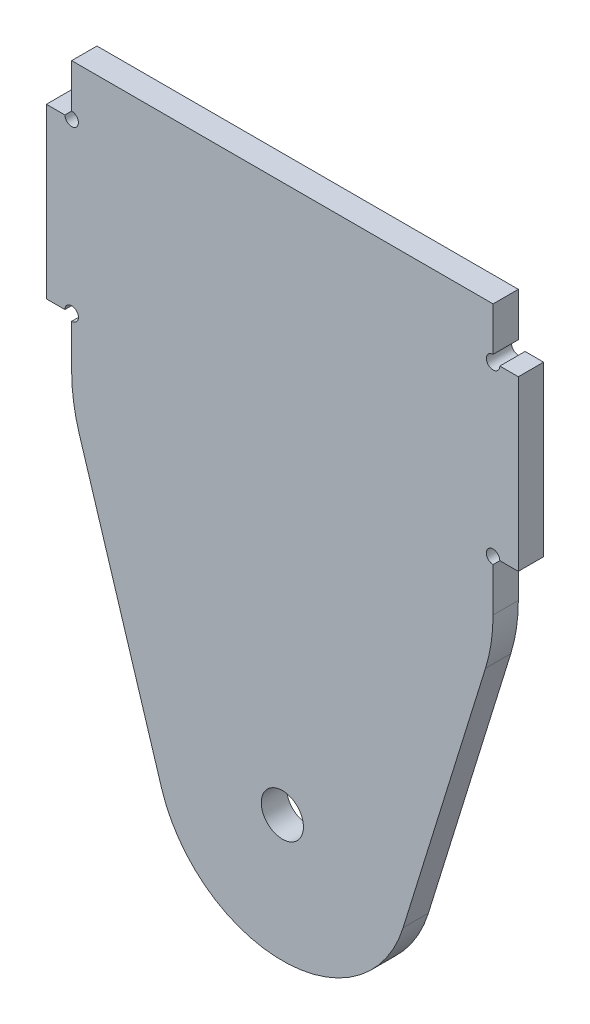
ISO-10303-21;
HEADER;
FILE_DESCRIPTION(('STEP AP214'),'2;1');
FILE_NAME('part.step','',(''),(''),'','','');
FILE_SCHEMA(('AUTOMOTIVE_DESIGN { 1 0 10303 214 1 1 1 1 }'));
ENDSEC;
DATA;
#1=APPLICATION_CONTEXT('core data for automotive mechanical design processes');
#2=APPLICATION_PROTOCOL_DEFINITION('international standard','automotive_design',2000,#1);
#3=PRODUCT_CONTEXT('',#1,'mechanical');
#4=PRODUCT('Part','Part','',(#3));
#5=PRODUCT_RELATED_PRODUCT_CATEGORY('part','',(#4));
#6=PRODUCT_DEFINITION_FORMATION('','',#4);
#7=PRODUCT_DEFINITION_CONTEXT('part definition',#1,'design');
#8=PRODUCT_DEFINITION('design','',#6,#7);
#9=PRODUCT_DEFINITION_SHAPE('','',#8);
#10=(LENGTH_UNIT() NAMED_UNIT(*) SI_UNIT(.MILLI.,.METRE.));
#11=(NAMED_UNIT(*) PLANE_ANGLE_UNIT() SI_UNIT($,.RADIAN.));
#12=(NAMED_UNIT(*) SI_UNIT($,.STERADIAN.) SOLID_ANGLE_UNIT());
#13=UNCERTAINTY_MEASURE_WITH_UNIT(LENGTH_MEASURE(1.E-05),#10,'distance_accuracy_value','');
#14=(GEOMETRIC_REPRESENTATION_CONTEXT(3) GLOBAL_UNCERTAINTY_ASSIGNED_CONTEXT((#13)) GLOBAL_UNIT_ASSIGNED_CONTEXT((#10,
#11,#12)) REPRESENTATION_CONTEXT('',''));
#15=CARTESIAN_POINT('',(0.,0.,0.));
#16=DIRECTION('',(0.,0.,1.));
#17=DIRECTION('',(1.,0.,0.));
#18=AXIS2_PLACEMENT_3D('',#15,#16,#17);
#19=CARTESIAN_POINT('',(25.,0.,3.));
#20=DIRECTION('',(-1.,0.,0.));
#21=DIRECTION('',(0.,-1.,0.));
#22=AXIS2_PLACEMENT_3D('',#19,#20,#21);
#23=PLANE('',#22);
#24=DIRECTION('',(0.,1.,0.));
#25=VECTOR('',#24,1.);
#26=CARTESIAN_POINT('',(25.,0.,0.));
#27=LINE('',#26,#25);
#28=CARTESIAN_POINT('',(25.,-14.4722436226801,0.));
#29=VERTEX_POINT('',#28);
#30=CARTESIAN_POINT('',(25.,-9.28612181134003,0.));
#31=VERTEX_POINT('',#30);
#32=EDGE_CURVE('E224',#29,#31,#27,.T.);
#33=ORIENTED_EDGE('',*,*,#32,.T.);
#34=DIRECTION('',(0.,0.,1.));
#35=VECTOR('',#34,1.);
#36=CARTESIAN_POINT('',(25.,-9.28612181134003,0.));
#37=LINE('',#36,#35);
#38=CARTESIAN_POINT('',(25.,-9.28612181134003,3.));
#39=VERTEX_POINT('',#38);
#40=EDGE_CURVE('E180',#31,#39,#37,.T.);
#41=ORIENTED_EDGE('',*,*,#40,.T.);
#42=DIRECTION('',(0.,1.,0.));
#43=VECTOR('',#42,1.);
#44=CARTESIAN_POINT('',(25.,0.,3.));
#45=LINE('',#44,#43);
#46=CARTESIAN_POINT('',(25.,-14.4722436226801,3.));
#47=VERTEX_POINT('',#46);
#48=EDGE_CURVE('E198',#47,#39,#45,.T.);
#49=ORIENTED_EDGE('',*,*,#48,.F.);
#50=DIRECTION('',(0.,0.,-1.));
#51=VECTOR('',#50,1.);
#52=CARTESIAN_POINT('',(25.,-14.4722436226801,0.));
#53=LINE('',#52,#51);
#54=EDGE_CURVE('E256',#47,#29,#53,.T.);
#55=ORIENTED_EDGE('',*,*,#54,.T.);
#56=EDGE_LOOP('',(#33,#41,#49,#55));
#57=FACE_BOUND('',#56,.T.);
#58=ADVANCED_FACE('F35',(#57),#23,.F.);
#59=CARTESIAN_POINT('',(-25.,0.,3.));
#60=DIRECTION('',(-1.,0.,0.));
#61=DIRECTION('',(0.,-1.,0.));
#62=AXIS2_PLACEMENT_3D('',#59,#60,#61);
#63=PLANE('',#62);
#64=DIRECTION('',(0.,0.,1.));
#65=VECTOR('',#64,1.);
#66=CARTESIAN_POINT('',(-25.,-9.28612181134003,0.));
#67=LINE('',#66,#65);
#68=CARTESIAN_POINT('',(-25.,-9.28612181134003,0.));
#69=VERTEX_POINT('',#68);
#70=CARTESIAN_POINT('',(-25.,-9.28612181134003,3.));
#71=VERTEX_POINT('',#70);
#72=EDGE_CURVE('E330',#69,#71,#67,.T.);
#73=ORIENTED_EDGE('',*,*,#72,.F.);
#74=DIRECTION('',(0.,1.,0.));
#75=VECTOR('',#74,1.);
#76=CARTESIAN_POINT('',(-25.,0.,0.));
#77=LINE('',#76,#75);
#78=CARTESIAN_POINT('',(-25.,-14.4722436226801,0.));
#79=VERTEX_POINT('',#78);
#80=EDGE_CURVE('E212',#79,#69,#77,.T.);
#81=ORIENTED_EDGE('',*,*,#80,.F.);
#82=DIRECTION('',(0.,0.,-1.));
#83=VECTOR('',#82,1.);
#84=CARTESIAN_POINT('',(-25.,-14.4722436226801,3.));
#85=LINE('',#84,#83);
#86=CARTESIAN_POINT('',(-25.,-14.4722436226801,3.));
#87=VERTEX_POINT('',#86);
#88=EDGE_CURVE('E250',#79,#87,#85,.F.);
#89=ORIENTED_EDGE('',*,*,#88,.T.);
#90=DIRECTION('',(0.,1.,0.));
#91=VECTOR('',#90,1.);
#92=CARTESIAN_POINT('',(-25.,0.,3.));
#93=LINE('',#92,#91);
#94=EDGE_CURVE('E301',#87,#71,#93,.T.);
#95=ORIENTED_EDGE('',*,*,#94,.T.);
#96=EDGE_LOOP('',(#73,#81,#89,#95));
#97=FACE_BOUND('',#96,.T.);
#98=ADVANCED_FACE('F364',(#97),#63,.T.);
#99=DIRECTION('',(0.,0.,1.));
#100=VECTOR('',#99,1.);
#101=CARTESIAN_POINT('',(-25.,12.31387818866,0.));
#102=LINE('',#101,#100);
#103=CARTESIAN_POINT('',(-25.,12.31387818866,3.));
#104=VERTEX_POINT('',#103);
#105=CARTESIAN_POINT('',(-25.,12.31387818866,0.));
#106=VERTEX_POINT('',#105);
#107=EDGE_CURVE('E328',#104,#106,#102,.F.);
#108=ORIENTED_EDGE('',*,*,#107,.F.);
#109=CARTESIAN_POINT('',(-25.,17.5,3.));
#110=VERTEX_POINT('',#109);
#111=EDGE_CURVE('E233',#104,#110,#93,.T.);
#112=ORIENTED_EDGE('',*,*,#111,.T.);
#113=DIRECTION('',(0.,0.,-1.));
#114=VECTOR('',#113,1.);
#115=CARTESIAN_POINT('',(-25.,17.5,3.));
#116=LINE('',#115,#114);
#117=CARTESIAN_POINT('',(-25.,17.5,0.));
#118=VERTEX_POINT('',#117);
#119=EDGE_CURVE('E211',#110,#118,#116,.T.);
#120=ORIENTED_EDGE('',*,*,#119,.T.);
#121=EDGE_CURVE('E216',#106,#118,#77,.T.);
#122=ORIENTED_EDGE('',*,*,#121,.F.);
#123=EDGE_LOOP('',(#108,#112,#120,#122));
#124=FACE_BOUND('',#123,.T.);
#125=ADVANCED_FACE('F383',(#124),#63,.T.);
#126=CARTESIAN_POINT('',(-27.757471044347,-8.60141557647442,3.));
#127=DIRECTION('',(0.955190414845375,0.295992012371146,0.));
#128=DIRECTION('',(-0.295992012371146,0.955190414845375,0.));
#129=AXIS2_PLACEMENT_3D('',#126,#127,#128);
#130=PLANE('',#129);
#131=DIRECTION('',(0.295992012371146,-0.955190414845375,0.));
#132=VECTOR('',#131,1.);
#133=CARTESIAN_POINT('',(-27.757471044347,-8.60141557647442,3.));
#134=LINE('',#133,#132);
#135=CARTESIAN_POINT('',(-24.1038082969075,-20.392083870103,3.));
#136=VERTEX_POINT('',#135);
#137=CARTESIAN_POINT('',(-14.3278562226806,-51.9398801855672,3.));
#138=VERTEX_POINT('',#137);
#139=EDGE_CURVE('E304',#136,#138,#134,.T.);
#140=ORIENTED_EDGE('',*,*,#139,.F.);
#141=DIRECTION('',(0.,0.,-1.));
#142=VECTOR('',#141,1.);
#143=CARTESIAN_POINT('',(-24.1038082969075,-20.392083870103,0.));
#144=LINE('',#143,#142);
#145=CARTESIAN_POINT('',(-24.1038082969075,-20.392083870103,0.));
#146=VERTEX_POINT('',#145);
#147=EDGE_CURVE('E243',#136,#146,#144,.T.);
#148=ORIENTED_EDGE('',*,*,#147,.T.);
#149=DIRECTION('',(0.295992012371146,-0.955190414845375,0.));
#150=VECTOR('',#149,1.);
#151=CARTESIAN_POINT('',(-27.757471044347,-8.60141557647442,0.));
#152=LINE('',#151,#150);
#153=CARTESIAN_POINT('',(-14.3278562226806,-51.9398801855672,0.));
#154=VERTEX_POINT('',#153);
#155=EDGE_CURVE('E215',#146,#154,#152,.T.);
#156=ORIENTED_EDGE('',*,*,#155,.T.);
#157=DIRECTION('',(0.,0.,-1.));
#158=VECTOR('',#157,1.);
#159=CARTESIAN_POINT('',(-14.3278562226806,-51.9398801855672,3.));
#160=LINE('',#159,#158);
#161=EDGE_CURVE('E240',#138,#154,#160,.T.);
#162=ORIENTED_EDGE('',*,*,#161,.F.);
#163=EDGE_LOOP('',(#140,#148,#156,#162));
#164=FACE_BOUND('',#163,.T.);
#165=ADVANCED_FACE('F371',(#164),#130,.F.);
#166=CARTESIAN_POINT('',(0.,-47.5,3.));
#167=DIRECTION('',(0.,0.,-1.));
#168=DIRECTION('',(-1.,0.,0.));
#169=AXIS2_PLACEMENT_3D('',#166,#167,#168);
#170=CYLINDRICAL_SURFACE('',#169,15.);
#171=CARTESIAN_POINT('',(0.,-47.5,0.));
#172=DIRECTION('',(0.,0.,1.));
#173=DIRECTION('',(1.,0.,0.));
#174=AXIS2_PLACEMENT_3D('',#171,#172,#173);
#175=CIRCLE('',#174,15.);
#176=CARTESIAN_POINT('',(14.3278562226806,-51.9398801855672,0.));
#177=VERTEX_POINT('',#176);
#178=EDGE_CURVE('E218',#154,#177,#175,.T.);
#179=ORIENTED_EDGE('',*,*,#178,.T.);
#180=DIRECTION('',(0.,0.,-1.));
#181=VECTOR('',#180,1.);
#182=CARTESIAN_POINT('',(14.3278562226806,-51.9398801855672,3.));
#183=LINE('',#182,#181);
#184=CARTESIAN_POINT('',(14.3278562226806,-51.9398801855672,3.));
#185=VERTEX_POINT('',#184);
#186=EDGE_CURVE('E237',#185,#177,#183,.T.);
#187=ORIENTED_EDGE('',*,*,#186,.F.);
#188=CARTESIAN_POINT('',(0.,-47.5,3.));
#189=DIRECTION('',(0.,0.,1.));
#190=DIRECTION('',(1.,0.,0.));
#191=AXIS2_PLACEMENT_3D('',#188,#189,#190);
#192=CIRCLE('',#191,15.);
#193=EDGE_CURVE('E203',#138,#185,#192,.T.);
#194=ORIENTED_EDGE('',*,*,#193,.F.);
#195=ORIENTED_EDGE('',*,*,#161,.T.);
#196=EDGE_LOOP('',(#179,#187,#194,#195));
#197=FACE_BOUND('',#196,.T.);
#198=ADVANCED_FACE('F313',(#197),#170,.T.);
#199=CARTESIAN_POINT('',(27.7574710443469,-8.60141557647441,3.));
#200=DIRECTION('',(0.955190414845375,-0.295992012371146,0.));
#201=DIRECTION('',(0.295992012371146,0.955190414845375,0.));
#202=AXIS2_PLACEMENT_3D('',#199,#200,#201);
#203=PLANE('',#202);
#204=DIRECTION('',(-0.295992012371146,-0.955190414845375,0.));
#205=VECTOR('',#204,1.);
#206=CARTESIAN_POINT('',(27.7574710443469,-8.60141557647441,0.));
#207=LINE('',#206,#205);
#208=CARTESIAN_POINT('',(24.1038082969075,-20.392083870103,0.));
#209=VERTEX_POINT('',#208);
#210=EDGE_CURVE('E221',#209,#177,#207,.T.);
#211=ORIENTED_EDGE('',*,*,#210,.F.);
#212=DIRECTION('',(0.,0.,-1.));
#213=VECTOR('',#212,1.);
#214=CARTESIAN_POINT('',(24.1038082969075,-20.392083870103,3.));
#215=LINE('',#214,#213);
#216=CARTESIAN_POINT('',(24.1038082969075,-20.392083870103,3.));
#217=VERTEX_POINT('',#216);
#218=EDGE_CURVE('E259',#209,#217,#215,.F.);
#219=ORIENTED_EDGE('',*,*,#218,.T.);
#220=DIRECTION('',(-0.295992012371146,-0.955190414845375,0.));
#221=VECTOR('',#220,1.);
#222=CARTESIAN_POINT('',(27.7574710443469,-8.60141557647441,3.));
#223=LINE('',#222,#221);
#224=EDGE_CURVE('E199',#217,#185,#223,.T.);
#225=ORIENTED_EDGE('',*,*,#224,.T.);
#226=ORIENTED_EDGE('',*,*,#186,.T.);
#227=EDGE_LOOP('',(#211,#219,#225,#226));
#228=FACE_BOUND('',#227,.T.);
#229=ADVANCED_FACE('F317',(#228),#203,.T.);
#230=CARTESIAN_POINT('',(25.,12.31387818866,3.));
#231=VERTEX_POINT('',#230);
#232=CARTESIAN_POINT('',(25.,17.5,3.));
#233=VERTEX_POINT('',#232);
#234=EDGE_CURVE('E187',#231,#233,#45,.T.);
#235=ORIENTED_EDGE('',*,*,#234,.F.);
#236=DIRECTION('',(0.,0.,1.));
#237=VECTOR('',#236,1.);
#238=CARTESIAN_POINT('',(25.,12.31387818866,0.));
#239=LINE('',#238,#237);
#240=CARTESIAN_POINT('',(25.,12.31387818866,0.));
#241=VERTEX_POINT('',#240);
#242=EDGE_CURVE('E170',#231,#241,#239,.F.);
#243=ORIENTED_EDGE('',*,*,#242,.T.);
#244=CARTESIAN_POINT('',(25.,17.5,0.));
#245=VERTEX_POINT('',#244);
#246=EDGE_CURVE('E223',#241,#245,#27,.T.);
#247=ORIENTED_EDGE('',*,*,#246,.T.);
#248=DIRECTION('',(0.,0.,-1.));
#249=VECTOR('',#248,1.);
#250=CARTESIAN_POINT('',(25.,17.5,3.));
#251=LINE('',#250,#249);
#252=EDGE_CURVE('E196',#233,#245,#251,.T.);
#253=ORIENTED_EDGE('',*,*,#252,.F.);
#254=EDGE_LOOP('',(#235,#243,#247,#253));
#255=FACE_BOUND('',#254,.T.);
#256=ADVANCED_FACE('F194',(#255),#23,.F.);
#257=CARTESIAN_POINT('',(0.,17.5,3.));
#258=DIRECTION('',(0.,1.,0.));
#259=DIRECTION('',(-1.,0.,0.));
#260=AXIS2_PLACEMENT_3D('',#257,#258,#259);
#261=PLANE('',#260);
#262=DIRECTION('',(1.,0.,0.));
#263=VECTOR('',#262,1.);
#264=CARTESIAN_POINT('',(0.,17.5,0.));
#265=LINE('',#264,#263);
#266=EDGE_CURVE('E227',#118,#245,#265,.T.);
#267=ORIENTED_EDGE('',*,*,#266,.F.);
#268=ORIENTED_EDGE('',*,*,#119,.F.);
#269=DIRECTION('',(1.,0.,0.));
#270=VECTOR('',#269,1.);
#271=CARTESIAN_POINT('',(0.,17.5,3.));
#272=LINE('',#271,#270);
#273=EDGE_CURVE('E202',#110,#233,#272,.T.);
#274=ORIENTED_EDGE('',*,*,#273,.T.);
#275=ORIENTED_EDGE('',*,*,#252,.T.);
#276=EDGE_LOOP('',(#267,#268,#274,#275));
#277=FACE_BOUND('',#276,.T.);
#278=ADVANCED_FACE('F387',(#277),#261,.T.);
#279=CARTESIAN_POINT('',(0.,-47.5,3.));
#280=DIRECTION('',(0.,0.,-1.));
#281=DIRECTION('',(-1.,0.,0.));
#282=AXIS2_PLACEMENT_3D('',#279,#280,#281);
#283=CYLINDRICAL_SURFACE('',#282,2.5);
#284=CARTESIAN_POINT('',(0.,-47.5,3.));
#285=DIRECTION('',(0.,0.,1.));
#286=DIRECTION('',(1.,0.,0.));
#287=AXIS2_PLACEMENT_3D('',#284,#285,#286);
#288=CIRCLE('',#287,2.5);
#289=CARTESIAN_POINT('',(2.50000000000001,-47.5,3.));
#290=VERTEX_POINT('',#289);
#291=EDGE_CURVE('E208',#290,#290,#288,.T.);
#292=ORIENTED_EDGE('',*,*,#291,.T.);
#293=EDGE_LOOP('',(#292));
#294=FACE_BOUND('',#293,.T.);
#295=CARTESIAN_POINT('',(0.,-47.5,0.));
#296=DIRECTION('',(0.,0.,1.));
#297=DIRECTION('',(1.,0.,0.));
#298=AXIS2_PLACEMENT_3D('',#295,#296,#297);
#299=CIRCLE('',#298,2.5);
#300=CARTESIAN_POINT('',(2.50000000000001,-47.5,0.));
#301=VERTEX_POINT('',#300);
#302=EDGE_CURVE('E230',#301,#301,#299,.T.);
#303=ORIENTED_EDGE('',*,*,#302,.F.);
#304=EDGE_LOOP('',(#303));
#305=FACE_BOUND('',#304,.T.);
#306=ADVANCED_FACE('F424',(#294,#305),#283,.F.);
#307=CARTESIAN_POINT('',(0.,0.,3.));
#308=DIRECTION('',(0.,0.,1.));
#309=DIRECTION('',(1.,0.,0.));
#310=AXIS2_PLACEMENT_3D('',#307,#308,#309);
#311=PLANE('',#310);
#312=CARTESIAN_POINT('',(-25.,-8.48612181134004,3.));
#313=DIRECTION('',(0.,0.,1.));
#314=DIRECTION('',(1.,0.,0.));
#315=AXIS2_PLACEMENT_3D('',#312,#313,#314);
#316=CIRCLE('',#315,0.799999999999999);
#317=CARTESIAN_POINT('',(-25.8,-8.48612181134004,3.));
#318=VERTEX_POINT('',#317);
#319=EDGE_CURVE('E49',#71,#318,#316,.T.);
#320=ORIENTED_EDGE('',*,*,#319,.F.);
#321=ORIENTED_EDGE('',*,*,#94,.F.);
#322=CARTESIAN_POINT('',(-5.,-14.4722436226801,3.));
#323=DIRECTION('',(0.,0.,1.));
#324=DIRECTION('',(1.,0.,0.));
#325=AXIS2_PLACEMENT_3D('',#322,#323,#324);
#326=CIRCLE('',#325,20.);
#327=EDGE_CURVE('E254',#87,#136,#326,.T.);
#328=ORIENTED_EDGE('',*,*,#327,.T.);
#329=ORIENTED_EDGE('',*,*,#139,.T.);
#330=ORIENTED_EDGE('',*,*,#193,.T.);
#331=ORIENTED_EDGE('',*,*,#224,.F.);
#332=CARTESIAN_POINT('',(5.,-14.4722436226801,3.));
#333=DIRECTION('',(0.,0.,1.));
#334=DIRECTION('',(1.,0.,0.));
#335=AXIS2_PLACEMENT_3D('',#332,#333,#334);
#336=CIRCLE('',#335,20.);
#337=EDGE_CURVE('E252',#217,#47,#336,.T.);
#338=ORIENTED_EDGE('',*,*,#337,.T.);
#339=ORIENTED_EDGE('',*,*,#48,.T.);
#340=CARTESIAN_POINT('',(25.,-8.48612181134004,3.));
#341=DIRECTION('',(0.,0.,1.));
#342=DIRECTION('',(1.,0.,0.));
#343=AXIS2_PLACEMENT_3D('',#340,#341,#342);
#344=CIRCLE('',#343,0.799999999999999);
#345=CARTESIAN_POINT('',(25.8,-8.48612181134004,3.));
#346=VERTEX_POINT('',#345);
#347=EDGE_CURVE('E375',#346,#39,#344,.T.);
#348=ORIENTED_EDGE('',*,*,#347,.F.);
#349=DIRECTION('',(1.,0.,0.));
#350=VECTOR('',#349,1.);
#351=CARTESIAN_POINT('',(28.,-8.48612181134004,3.));
#352=LINE('',#351,#350);
#353=CARTESIAN_POINT('',(28.,-8.48612181134004,3.));
#354=VERTEX_POINT('',#353);
#355=EDGE_CURVE('E342',#346,#354,#352,.T.);
#356=ORIENTED_EDGE('',*,*,#355,.T.);
#357=DIRECTION('',(0.,1.,0.));
#358=VECTOR('',#357,1.);
#359=CARTESIAN_POINT('',(28.,-8.48612181134004,3.));
#360=LINE('',#359,#358);
#361=CARTESIAN_POINT('',(28.,11.51387818866,3.));
#362=VERTEX_POINT('',#361);
#363=EDGE_CURVE('E334',#354,#362,#360,.T.);
#364=ORIENTED_EDGE('',*,*,#363,.T.);
#365=DIRECTION('',(-1.,0.,0.));
#366=VECTOR('',#365,1.);
#367=CARTESIAN_POINT('',(28.,11.51387818866,3.));
#368=LINE('',#367,#366);
#369=CARTESIAN_POINT('',(25.8,11.51387818866,3.));
#370=VERTEX_POINT('',#369);
#371=EDGE_CURVE('E191',#362,#370,#368,.T.);
#372=ORIENTED_EDGE('',*,*,#371,.T.);
#373=CARTESIAN_POINT('',(25.,11.51387818866,3.));
#374=DIRECTION('',(0.,0.,1.));
#375=DIRECTION('',(1.,0.,0.));
#376=AXIS2_PLACEMENT_3D('',#373,#374,#375);
#377=CIRCLE('',#376,0.799999999999999);
#378=EDGE_CURVE('E173',#231,#370,#377,.T.);
#379=ORIENTED_EDGE('',*,*,#378,.F.);
#380=ORIENTED_EDGE('',*,*,#234,.T.);
#381=ORIENTED_EDGE('',*,*,#273,.F.);
#382=ORIENTED_EDGE('',*,*,#111,.F.);
#383=CARTESIAN_POINT('',(-25.,11.51387818866,3.));
#384=DIRECTION('',(0.,0.,1.));
#385=DIRECTION('',(1.,0.,0.));
#386=AXIS2_PLACEMENT_3D('',#383,#384,#385);
#387=CIRCLE('',#386,0.799999999999999);
#388=CARTESIAN_POINT('',(-25.8,11.51387818866,3.));
#389=VERTEX_POINT('',#388);
#390=EDGE_CURVE('E266',#389,#104,#387,.T.);
#391=ORIENTED_EDGE('',*,*,#390,.F.);
#392=DIRECTION('',(-1.,0.,0.));
#393=VECTOR('',#392,1.);
#394=CARTESIAN_POINT('',(-28.,11.51387818866,3.));
#395=LINE('',#394,#393);
#396=CARTESIAN_POINT('',(-28.,11.51387818866,3.));
#397=VERTEX_POINT('',#396);
#398=EDGE_CURVE('E274',#389,#397,#395,.T.);
#399=ORIENTED_EDGE('',*,*,#398,.T.);
#400=DIRECTION('',(0.,-1.,0.));
#401=VECTOR('',#400,1.);
#402=CARTESIAN_POINT('',(-28.,-8.48612181134004,3.));
#403=LINE('',#402,#401);
#404=CARTESIAN_POINT('',(-28.,-8.48612181134004,3.));
#405=VERTEX_POINT('',#404);
#406=EDGE_CURVE('E282',#397,#405,#403,.T.);
#407=ORIENTED_EDGE('',*,*,#406,.T.);
#408=DIRECTION('',(1.,0.,0.));
#409=VECTOR('',#408,1.);
#410=CARTESIAN_POINT('',(-28.,-8.48612181134004,3.));
#411=LINE('',#410,#409);
#412=EDGE_CURVE('E285',#405,#318,#411,.T.);
#413=ORIENTED_EDGE('',*,*,#412,.T.);
#414=EDGE_LOOP('',(#320,#321,#328,#329,#330,#331,#338,#339,#348,#356,#364,#372,#379,#380,#381,
#382,#391,#399,#407,#413));
#415=FACE_BOUND('',#414,.T.);
#416=ORIENTED_EDGE('',*,*,#291,.F.);
#417=EDGE_LOOP('',(#416));
#418=FACE_BOUND('',#417,.T.);
#419=ADVANCED_FACE('F184',(#415,#418),#311,.T.);
#420=CARTESIAN_POINT('',(0.,0.,0.));
#421=DIRECTION('',(0.,0.,1.));
#422=DIRECTION('',(1.,0.,0.));
#423=AXIS2_PLACEMENT_3D('',#420,#421,#422);
#424=PLANE('',#423);
#425=ORIENTED_EDGE('',*,*,#80,.T.);
#426=CARTESIAN_POINT('',(-25.,-8.48612181134004,0.));
#427=DIRECTION('',(0.,0.,1.));
#428=DIRECTION('',(1.,0.,0.));
#429=AXIS2_PLACEMENT_3D('',#426,#427,#428);
#430=CIRCLE('',#429,0.799999999999999);
#431=CARTESIAN_POINT('',(-25.8,-8.48612181134004,0.));
#432=VERTEX_POINT('',#431);
#433=EDGE_CURVE('E276',#69,#432,#430,.T.);
#434=ORIENTED_EDGE('',*,*,#433,.T.);
#435=DIRECTION('',(-1.,0.,0.));
#436=VECTOR('',#435,1.);
#437=CARTESIAN_POINT('',(-28.,-8.48612181134004,0.));
#438=LINE('',#437,#436);
#439=CARTESIAN_POINT('',(-28.,-8.48612181134004,0.));
#440=VERTEX_POINT('',#439);
#441=EDGE_CURVE('E290',#432,#440,#438,.T.);
#442=ORIENTED_EDGE('',*,*,#441,.T.);
#443=DIRECTION('',(0.,1.,0.));
#444=VECTOR('',#443,1.);
#445=CARTESIAN_POINT('',(-28.,-8.48612181134004,0.));
#446=LINE('',#445,#444);
#447=CARTESIAN_POINT('',(-28.,11.51387818866,0.));
#448=VERTEX_POINT('',#447);
#449=EDGE_CURVE('E297',#440,#448,#446,.T.);
#450=ORIENTED_EDGE('',*,*,#449,.T.);
#451=DIRECTION('',(1.,0.,0.));
#452=VECTOR('',#451,1.);
#453=CARTESIAN_POINT('',(-28.,11.51387818866,0.));
#454=LINE('',#453,#452);
#455=CARTESIAN_POINT('',(-25.8,11.51387818866,0.));
#456=VERTEX_POINT('',#455);
#457=EDGE_CURVE('E299',#448,#456,#454,.T.);
#458=ORIENTED_EDGE('',*,*,#457,.T.);
#459=CARTESIAN_POINT('',(-25.,11.51387818866,0.));
#460=DIRECTION('',(0.,0.,1.));
#461=DIRECTION('',(1.,0.,0.));
#462=AXIS2_PLACEMENT_3D('',#459,#460,#461);
#463=CIRCLE('',#462,0.799999999999999);
#464=EDGE_CURVE('E57',#456,#106,#463,.T.);
#465=ORIENTED_EDGE('',*,*,#464,.T.);
#466=ORIENTED_EDGE('',*,*,#121,.T.);
#467=ORIENTED_EDGE('',*,*,#266,.T.);
#468=ORIENTED_EDGE('',*,*,#246,.F.);
#469=CARTESIAN_POINT('',(25.,11.51387818866,0.));
#470=DIRECTION('',(0.,0.,1.));
#471=DIRECTION('',(1.,0.,0.));
#472=AXIS2_PLACEMENT_3D('',#469,#470,#471);
#473=CIRCLE('',#472,0.799999999999999);
#474=CARTESIAN_POINT('',(25.8,11.51387818866,0.));
#475=VERTEX_POINT('',#474);
#476=EDGE_CURVE('E176',#241,#475,#473,.T.);
#477=ORIENTED_EDGE('',*,*,#476,.T.);
#478=DIRECTION('',(1.,0.,0.));
#479=VECTOR('',#478,1.);
#480=CARTESIAN_POINT('',(28.,11.51387818866,0.));
#481=LINE('',#480,#479);
#482=CARTESIAN_POINT('',(28.,11.51387818866,0.));
#483=VERTEX_POINT('',#482);
#484=EDGE_CURVE('E283',#475,#483,#481,.T.);
#485=ORIENTED_EDGE('',*,*,#484,.T.);
#486=DIRECTION('',(0.,-1.,0.));
#487=VECTOR('',#486,1.);
#488=CARTESIAN_POINT('',(28.,-8.48612181134004,0.));
#489=LINE('',#488,#487);
#490=CARTESIAN_POINT('',(28.,-8.48612181134004,0.));
#491=VERTEX_POINT('',#490);
#492=EDGE_CURVE('E287',#483,#491,#489,.T.);
#493=ORIENTED_EDGE('',*,*,#492,.T.);
#494=DIRECTION('',(-1.,0.,0.));
#495=VECTOR('',#494,1.);
#496=CARTESIAN_POINT('',(28.,-8.48612181134004,0.));
#497=LINE('',#496,#495);
#498=CARTESIAN_POINT('',(25.8,-8.48612181134004,0.));
#499=VERTEX_POINT('',#498);
#500=EDGE_CURVE('E335',#491,#499,#497,.T.);
#501=ORIENTED_EDGE('',*,*,#500,.T.);
#502=CARTESIAN_POINT('',(25.,-8.48612181134004,0.));
#503=DIRECTION('',(0.,0.,1.));
#504=DIRECTION('',(1.,0.,0.));
#505=AXIS2_PLACEMENT_3D('',#502,#503,#504);
#506=CIRCLE('',#505,0.799999999999999);
#507=EDGE_CURVE('E192',#499,#31,#506,.T.);
#508=ORIENTED_EDGE('',*,*,#507,.T.);
#509=ORIENTED_EDGE('',*,*,#32,.F.);
#510=CARTESIAN_POINT('',(5.,-14.4722436226801,0.));
#511=DIRECTION('',(0.,0.,1.));
#512=DIRECTION('',(1.,0.,0.));
#513=AXIS2_PLACEMENT_3D('',#510,#511,#512);
#514=CIRCLE('',#513,20.);
#515=EDGE_CURVE('E246',#29,#209,#514,.F.);
#516=ORIENTED_EDGE('',*,*,#515,.T.);
#517=ORIENTED_EDGE('',*,*,#210,.T.);
#518=ORIENTED_EDGE('',*,*,#178,.F.);
#519=ORIENTED_EDGE('',*,*,#155,.F.);
#520=CARTESIAN_POINT('',(-5.,-14.4722436226801,0.));
#521=DIRECTION('',(0.,0.,1.));
#522=DIRECTION('',(1.,0.,0.));
#523=AXIS2_PLACEMENT_3D('',#520,#521,#522);
#524=CIRCLE('',#523,20.);
#525=EDGE_CURVE('E248',#146,#79,#524,.F.);
#526=ORIENTED_EDGE('',*,*,#525,.T.);
#527=EDGE_LOOP('',(#425,#434,#442,#450,#458,#465,#466,#467,#468,#477,#485,#493,#501,#508,#509,
#516,#517,#518,#519,#526));
#528=FACE_BOUND('',#527,.T.);
#529=ORIENTED_EDGE('',*,*,#302,.T.);
#530=EDGE_LOOP('',(#529));
#531=FACE_BOUND('',#530,.T.);
#532=ADVANCED_FACE('F351',(#528,#531),#424,.F.);
#533=CARTESIAN_POINT('',(-5.,-14.4722436226801,3.));
#534=DIRECTION('',(0.,0.,1.));
#535=DIRECTION('',(1.,0.,0.));
#536=AXIS2_PLACEMENT_3D('',#533,#534,#535);
#537=CYLINDRICAL_SURFACE('',#536,20.);
#538=ORIENTED_EDGE('',*,*,#327,.F.);
#539=ORIENTED_EDGE('',*,*,#88,.F.);
#540=ORIENTED_EDGE('',*,*,#525,.F.);
#541=ORIENTED_EDGE('',*,*,#147,.F.);
#542=EDGE_LOOP('',(#538,#539,#540,#541));
#543=FACE_BOUND('',#542,.T.);
#544=ADVANCED_FACE('F368',(#543),#537,.T.);
#545=CARTESIAN_POINT('',(5.,-14.4722436226801,3.));
#546=DIRECTION('',(0.,0.,1.));
#547=DIRECTION('',(1.,0.,0.));
#548=AXIS2_PLACEMENT_3D('',#545,#546,#547);
#549=CYLINDRICAL_SURFACE('',#548,20.);
#550=ORIENTED_EDGE('',*,*,#337,.F.);
#551=ORIENTED_EDGE('',*,*,#218,.F.);
#552=ORIENTED_EDGE('',*,*,#515,.F.);
#553=ORIENTED_EDGE('',*,*,#54,.F.);
#554=EDGE_LOOP('',(#550,#551,#552,#553));
#555=FACE_BOUND('',#554,.T.);
#556=ADVANCED_FACE('F37',(#555),#549,.T.);
#557=CARTESIAN_POINT('',(-28.,-8.48612181134004,-20.8806130178211));
#558=DIRECTION('',(0.,-1.,0.));
#559=DIRECTION('',(0.,0.,-1.));
#560=AXIS2_PLACEMENT_3D('',#557,#558,#559);
#561=PLANE('',#560);
#562=DIRECTION('',(0.,0.,1.));
#563=VECTOR('',#562,1.);
#564=CARTESIAN_POINT('',(-25.8,-8.48612181134004,0.));
#565=LINE('',#564,#563);
#566=EDGE_CURVE('E11',#318,#432,#565,.F.);
#567=ORIENTED_EDGE('',*,*,#566,.F.);
#568=ORIENTED_EDGE('',*,*,#412,.F.);
#569=DIRECTION('',(0.,0.,1.));
#570=VECTOR('',#569,1.);
#571=CARTESIAN_POINT('',(-28.,-8.48612181134004,-20.8806130178211));
#572=LINE('',#571,#570);
#573=EDGE_CURVE('E295',#440,#405,#572,.T.);
#574=ORIENTED_EDGE('',*,*,#573,.F.);
#575=ORIENTED_EDGE('',*,*,#441,.F.);
#576=EDGE_LOOP('',(#567,#568,#574,#575));
#577=FACE_BOUND('',#576,.T.);
#578=ADVANCED_FACE('F358',(#577),#561,.T.);
#579=CARTESIAN_POINT('',(-28.,-8.48612181134004,-20.8806130178211));
#580=DIRECTION('',(-1.,0.,0.));
#581=DIRECTION('',(0.,0.,1.));
#582=AXIS2_PLACEMENT_3D('',#579,#580,#581);
#583=PLANE('',#582);
#584=ORIENTED_EDGE('',*,*,#449,.F.);
#585=ORIENTED_EDGE('',*,*,#573,.T.);
#586=ORIENTED_EDGE('',*,*,#406,.F.);
#587=DIRECTION('',(0.,0.,1.));
#588=VECTOR('',#587,1.);
#589=CARTESIAN_POINT('',(-28.,11.51387818866,-20.8806130178211));
#590=LINE('',#589,#588);
#591=EDGE_CURVE('E280',#448,#397,#590,.T.);
#592=ORIENTED_EDGE('',*,*,#591,.F.);
#593=EDGE_LOOP('',(#584,#585,#586,#592));
#594=FACE_BOUND('',#593,.T.);
#595=ADVANCED_FACE('F356',(#594),#583,.T.);
#596=CARTESIAN_POINT('',(-28.,11.51387818866,-20.8806130178211));
#597=DIRECTION('',(0.,1.,0.));
#598=DIRECTION('',(0.,0.,1.));
#599=AXIS2_PLACEMENT_3D('',#596,#597,#598);
#600=PLANE('',#599);
#601=DIRECTION('',(0.,0.,1.));
#602=VECTOR('',#601,1.);
#603=CARTESIAN_POINT('',(-25.8,11.51387818866,0.));
#604=LINE('',#603,#602);
#605=EDGE_CURVE('E43',#456,#389,#604,.T.);
#606=ORIENTED_EDGE('',*,*,#605,.F.);
#607=ORIENTED_EDGE('',*,*,#457,.F.);
#608=ORIENTED_EDGE('',*,*,#591,.T.);
#609=ORIENTED_EDGE('',*,*,#398,.F.);
#610=EDGE_LOOP('',(#606,#607,#608,#609));
#611=FACE_BOUND('',#610,.T.);
#612=ADVANCED_FACE('F278',(#611),#600,.T.);
#613=CARTESIAN_POINT('',(28.,-8.48612181134004,-20.8806130178211));
#614=DIRECTION('',(0.,-1.,0.));
#615=DIRECTION('',(0.,0.,-1.));
#616=AXIS2_PLACEMENT_3D('',#613,#614,#615);
#617=PLANE('',#616);
#618=DIRECTION('',(0.,0.,1.));
#619=VECTOR('',#618,1.);
#620=CARTESIAN_POINT('',(25.8,-8.48612181134004,0.));
#621=LINE('',#620,#619);
#622=EDGE_CURVE('E263',#499,#346,#621,.T.);
#623=ORIENTED_EDGE('',*,*,#622,.F.);
#624=ORIENTED_EDGE('',*,*,#500,.F.);
#625=DIRECTION('',(0.,0.,1.));
#626=VECTOR('',#625,1.);
#627=CARTESIAN_POINT('',(28.,-8.48612181134004,-20.8806130178211));
#628=LINE('',#627,#626);
#629=EDGE_CURVE('E338',#491,#354,#628,.T.);
#630=ORIENTED_EDGE('',*,*,#629,.T.);
#631=ORIENTED_EDGE('',*,*,#355,.F.);
#632=EDGE_LOOP('',(#623,#624,#630,#631));
#633=FACE_BOUND('',#632,.T.);
#634=ADVANCED_FACE('F398',(#633),#617,.T.);
#635=CARTESIAN_POINT('',(28.,11.51387818866,-20.8806130178211));
#636=DIRECTION('',(0.,1.,0.));
#637=DIRECTION('',(0.,0.,1.));
#638=AXIS2_PLACEMENT_3D('',#635,#636,#637);
#639=PLANE('',#638);
#640=DIRECTION('',(0.,0.,1.));
#641=VECTOR('',#640,1.);
#642=CARTESIAN_POINT('',(25.8,11.51387818866,0.));
#643=LINE('',#642,#641);
#644=EDGE_CURVE('E261',#370,#475,#643,.F.);
#645=ORIENTED_EDGE('',*,*,#644,.F.);
#646=ORIENTED_EDGE('',*,*,#371,.F.);
#647=DIRECTION('',(0.,0.,1.));
#648=VECTOR('',#647,1.);
#649=CARTESIAN_POINT('',(28.,11.51387818866,-20.8806130178211));
#650=LINE('',#649,#648);
#651=EDGE_CURVE('E344',#483,#362,#650,.T.);
#652=ORIENTED_EDGE('',*,*,#651,.F.);
#653=ORIENTED_EDGE('',*,*,#484,.F.);
#654=EDGE_LOOP('',(#645,#646,#652,#653));
#655=FACE_BOUND('',#654,.T.);
#656=ADVANCED_FACE('F392',(#655),#639,.T.);
#657=CARTESIAN_POINT('',(28.,-8.48612181134004,-20.8806130178211));
#658=DIRECTION('',(1.,0.,0.));
#659=DIRECTION('',(0.,0.,-1.));
#660=AXIS2_PLACEMENT_3D('',#657,#658,#659);
#661=PLANE('',#660);
#662=ORIENTED_EDGE('',*,*,#492,.F.);
#663=ORIENTED_EDGE('',*,*,#651,.T.);
#664=ORIENTED_EDGE('',*,*,#363,.F.);
#665=ORIENTED_EDGE('',*,*,#629,.F.);
#666=EDGE_LOOP('',(#662,#663,#664,#665));
#667=FACE_BOUND('',#666,.T.);
#668=ADVANCED_FACE('F395',(#667),#661,.T.);
#669=CARTESIAN_POINT('',(25.,11.51387818866,0.));
#670=DIRECTION('',(0.,0.,1.));
#671=DIRECTION('',(1.,0.,0.));
#672=AXIS2_PLACEMENT_3D('',#669,#670,#671);
#673=CYLINDRICAL_SURFACE('',#672,0.799999999999999);
#674=ORIENTED_EDGE('',*,*,#378,.T.);
#675=ORIENTED_EDGE('',*,*,#644,.T.);
#676=ORIENTED_EDGE('',*,*,#476,.F.);
#677=ORIENTED_EDGE('',*,*,#242,.F.);
#678=EDGE_LOOP('',(#674,#675,#676,#677));
#679=FACE_BOUND('',#678,.T.);
#680=ADVANCED_FACE('F172',(#679),#673,.F.);
#681=CARTESIAN_POINT('',(25.,-8.48612181134004,0.));
#682=DIRECTION('',(0.,0.,1.));
#683=DIRECTION('',(1.,0.,0.));
#684=AXIS2_PLACEMENT_3D('',#681,#682,#683);
#685=CYLINDRICAL_SURFACE('',#684,0.799999999999999);
#686=ORIENTED_EDGE('',*,*,#507,.F.);
#687=ORIENTED_EDGE('',*,*,#622,.T.);
#688=ORIENTED_EDGE('',*,*,#347,.T.);
#689=ORIENTED_EDGE('',*,*,#40,.F.);
#690=EDGE_LOOP('',(#686,#687,#688,#689));
#691=FACE_BOUND('',#690,.T.);
#692=ADVANCED_FACE('F400',(#691),#685,.F.);
#693=CARTESIAN_POINT('',(-25.,11.51387818866,0.));
#694=DIRECTION('',(0.,0.,1.));
#695=DIRECTION('',(1.,0.,0.));
#696=AXIS2_PLACEMENT_3D('',#693,#694,#695);
#697=CYLINDRICAL_SURFACE('',#696,0.799999999999999);
#698=ORIENTED_EDGE('',*,*,#107,.T.);
#699=ORIENTED_EDGE('',*,*,#464,.F.);
#700=ORIENTED_EDGE('',*,*,#605,.T.);
#701=ORIENTED_EDGE('',*,*,#390,.T.);
#702=EDGE_LOOP('',(#698,#699,#700,#701));
#703=FACE_BOUND('',#702,.T.);
#704=ADVANCED_FACE('F265',(#703),#697,.F.);
#705=CARTESIAN_POINT('',(-25.,-8.48612181134004,0.));
#706=DIRECTION('',(0.,0.,1.));
#707=DIRECTION('',(1.,0.,0.));
#708=AXIS2_PLACEMENT_3D('',#705,#706,#707);
#709=CYLINDRICAL_SURFACE('',#708,0.799999999999999);
#710=ORIENTED_EDGE('',*,*,#72,.T.);
#711=ORIENTED_EDGE('',*,*,#319,.T.);
#712=ORIENTED_EDGE('',*,*,#566,.T.);
#713=ORIENTED_EDGE('',*,*,#433,.F.);
#714=EDGE_LOOP('',(#710,#711,#712,#713));
#715=FACE_BOUND('',#714,.T.);
#716=ADVANCED_FACE('F407',(#715),#709,.F.);
#717=CLOSED_SHELL('',(#58,#98,#125,#165,#198,#229,#256,#278,#306,#419,#532,#544,#556,#578,#595,
#612,#634,#656,#668,#680,#692,#704,#716));
#718=MANIFOLD_SOLID_BREP('B2',#717);
#719=ADVANCED_BREP_SHAPE_REPRESENTATION('',(#18,#718),#14);
#720=SHAPE_DEFINITION_REPRESENTATION(#9,#719);
ENDSEC;
END-ISO-10303-21;
